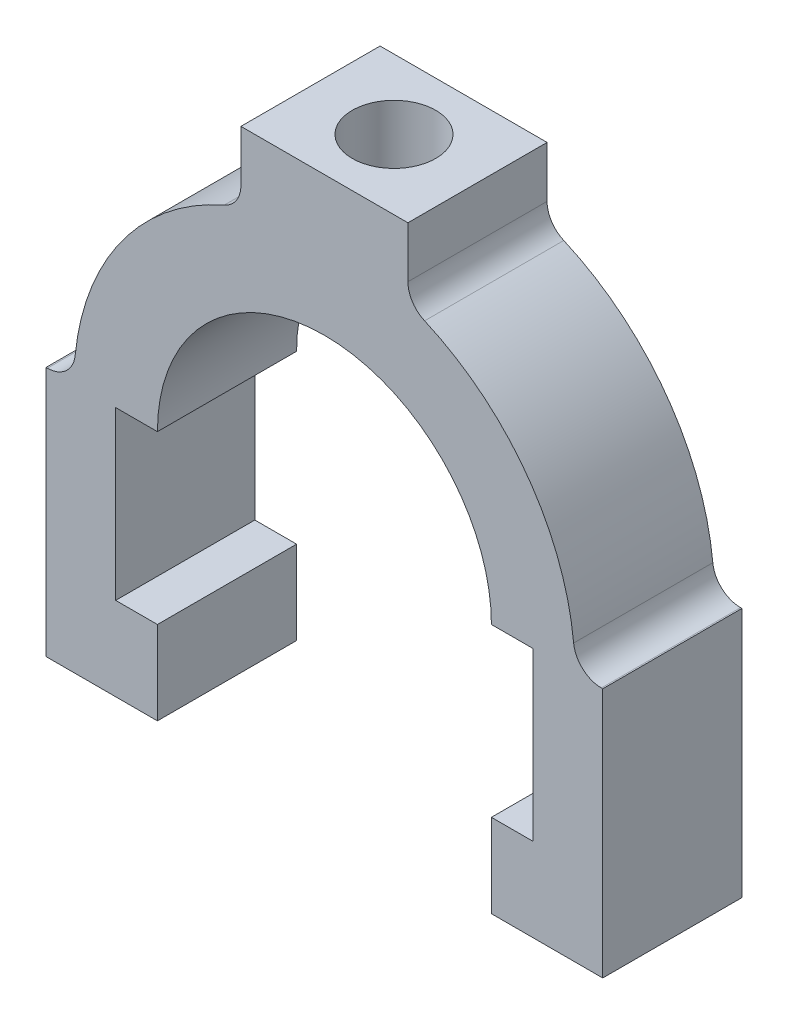
ISO-10303-21;
HEADER;
FILE_DESCRIPTION(('STEP AP214'),'2;1');
FILE_NAME('part.step','',(''),(''),'','','');
FILE_SCHEMA(('AUTOMOTIVE_DESIGN { 1 0 10303 214 1 1 1 1 }'));
ENDSEC;
DATA;
#1=APPLICATION_CONTEXT('core data for automotive mechanical design processes');
#2=APPLICATION_PROTOCOL_DEFINITION('international standard','automotive_design',2000,#1);
#3=PRODUCT_CONTEXT('',#1,'mechanical');
#4=PRODUCT('Part','Part','',(#3));
#5=PRODUCT_RELATED_PRODUCT_CATEGORY('part','',(#4));
#6=PRODUCT_DEFINITION_FORMATION('','',#4);
#7=PRODUCT_DEFINITION_CONTEXT('part definition',#1,'design');
#8=PRODUCT_DEFINITION('design','',#6,#7);
#9=PRODUCT_DEFINITION_SHAPE('','',#8);
#10=(LENGTH_UNIT() NAMED_UNIT(*) SI_UNIT(.MILLI.,.METRE.));
#11=(NAMED_UNIT(*) PLANE_ANGLE_UNIT() SI_UNIT($,.RADIAN.));
#12=(NAMED_UNIT(*) SI_UNIT($,.STERADIAN.) SOLID_ANGLE_UNIT());
#13=UNCERTAINTY_MEASURE_WITH_UNIT(LENGTH_MEASURE(1.E-05),#10,'distance_accuracy_value','');
#14=(GEOMETRIC_REPRESENTATION_CONTEXT(3) GLOBAL_UNCERTAINTY_ASSIGNED_CONTEXT((#13)) GLOBAL_UNIT_ASSIGNED_CONTEXT((#10,
#11,#12)) REPRESENTATION_CONTEXT('',''));
#15=CARTESIAN_POINT('',(0.,0.,0.));
#16=DIRECTION('',(0.,0.,1.));
#17=DIRECTION('',(1.,0.,0.));
#18=AXIS2_PLACEMENT_3D('',#15,#16,#17);
#19=CARTESIAN_POINT('',(-0.20050251573521,40.,20.));
#20=DIRECTION('',(0.,0.,-1.));
#21=DIRECTION('',(-1.,0.,0.));
#22=AXIS2_PLACEMENT_3D('',#19,#20,#21);
#23=CYLINDRICAL_SURFACE('',#22,4.);
#24=CARTESIAN_POINT('',(-0.20050251573521,40.,0.));
#25=DIRECTION('',(0.,0.,-1.));
#26=DIRECTION('',(-1.,0.,0.));
#27=AXIS2_PLACEMENT_3D('',#24,#25,#26);
#28=CIRCLE('',#27,4.);
#29=CARTESIAN_POINT('',(-0.20050251573521,36.,0.));
#30=VERTEX_POINT('',#29);
#31=CARTESIAN_POINT('',(-4.18045226416167,39.6,0.));
#32=VERTEX_POINT('',#31);
#33=EDGE_CURVE('E239',#30,#32,#28,.T.);
#34=ORIENTED_EDGE('',*,*,#33,.T.);
#35=DIRECTION('',(0.,0.,-1.));
#36=VECTOR('',#35,1.);
#37=CARTESIAN_POINT('',(-4.18045226416167,39.6,20.));
#38=LINE('',#37,#36);
#39=CARTESIAN_POINT('',(-4.18045226416167,39.6,20.));
#40=VERTEX_POINT('',#39);
#41=EDGE_CURVE('E11',#40,#32,#38,.T.);
#42=ORIENTED_EDGE('',*,*,#41,.F.);
#43=CARTESIAN_POINT('',(-0.20050251573521,40.,20.));
#44=DIRECTION('',(0.,0.,-1.));
#45=DIRECTION('',(-1.,0.,0.));
#46=AXIS2_PLACEMENT_3D('',#43,#44,#45);
#47=CIRCLE('',#46,4.);
#48=CARTESIAN_POINT('',(-0.20050251573521,36.,20.));
#49=VERTEX_POINT('',#48);
#50=EDGE_CURVE('E299',#49,#40,#47,.T.);
#51=ORIENTED_EDGE('',*,*,#50,.F.);
#52=DIRECTION('',(0.,0.,-1.));
#53=VECTOR('',#52,1.);
#54=CARTESIAN_POINT('',(-0.20050251573521,36.,20.));
#55=LINE('',#54,#53);
#56=EDGE_CURVE('E238',#49,#30,#55,.T.);
#57=ORIENTED_EDGE('',*,*,#56,.T.);
#58=EDGE_LOOP('',(#34,#42,#51,#57));
#59=FACE_BOUND('',#58,.T.);
#60=ADVANCED_FACE('F39',(#59),#23,.F.);
#61=CARTESIAN_POINT('',(-40.,36.,20.));
#62=DIRECTION('',(0.,0.,-1.));
#63=DIRECTION('',(-1.,0.,0.));
#64=AXIS2_PLACEMENT_3D('',#61,#62,#63);
#65=CYLINDRICAL_SURFACE('',#64,36.);
#66=CARTESIAN_POINT('',(-40.,36.,0.));
#67=DIRECTION('',(0.,0.,1.));
#68=DIRECTION('',(1.,0.,0.));
#69=AXIS2_PLACEMENT_3D('',#66,#67,#68);
#70=CIRCLE('',#69,36.);
#71=CARTESIAN_POINT('',(-25.6,68.9945450036821,0.));
#72=VERTEX_POINT('',#71);
#73=EDGE_CURVE('E242',#32,#72,#70,.T.);
#74=ORIENTED_EDGE('',*,*,#73,.T.);
#75=DIRECTION('',(0.,0.,-1.));
#76=VECTOR('',#75,1.);
#77=CARTESIAN_POINT('',(-25.6,68.9945450036821,20.));
#78=LINE('',#77,#76);
#79=CARTESIAN_POINT('',(-25.6,68.9945450036821,20.));
#80=VERTEX_POINT('',#79);
#81=EDGE_CURVE('E53',#80,#72,#78,.T.);
#82=ORIENTED_EDGE('',*,*,#81,.F.);
#83=CARTESIAN_POINT('',(-40.,36.,20.));
#84=DIRECTION('',(0.,0.,1.));
#85=DIRECTION('',(1.,0.,0.));
#86=AXIS2_PLACEMENT_3D('',#83,#84,#85);
#87=CIRCLE('',#86,36.);
#88=EDGE_CURVE('E151',#40,#80,#87,.T.);
#89=ORIENTED_EDGE('',*,*,#88,.F.);
#90=ORIENTED_EDGE('',*,*,#41,.T.);
#91=EDGE_LOOP('',(#74,#82,#89,#90));
#92=FACE_BOUND('',#91,.T.);
#93=ADVANCED_FACE('F428',(#92),#65,.T.);
#94=CARTESIAN_POINT('',(-24.,72.6606055596468,20.));
#95=DIRECTION('',(0.,0.,-1.));
#96=DIRECTION('',(-1.,0.,0.));
#97=AXIS2_PLACEMENT_3D('',#94,#95,#96);
#98=CYLINDRICAL_SURFACE('',#97,4.00000000000002);
#99=CARTESIAN_POINT('',(-24.,72.6606055596468,0.));
#100=DIRECTION('',(0.,0.,-1.));
#101=DIRECTION('',(-1.,0.,0.));
#102=AXIS2_PLACEMENT_3D('',#99,#100,#101);
#103=CIRCLE('',#102,4.00000000000002);
#104=CARTESIAN_POINT('',(-28.,72.6606055596468,0.));
#105=VERTEX_POINT('',#104);
#106=EDGE_CURVE('E244',#72,#105,#103,.T.);
#107=ORIENTED_EDGE('',*,*,#106,.T.);
#108=DIRECTION('',(0.,0.,-1.));
#109=VECTOR('',#108,1.);
#110=CARTESIAN_POINT('',(-28.,72.6606055596468,20.));
#111=LINE('',#110,#109);
#112=CARTESIAN_POINT('',(-28.,72.6606055596468,20.));
#113=VERTEX_POINT('',#112);
#114=EDGE_CURVE('E341',#113,#105,#111,.T.);
#115=ORIENTED_EDGE('',*,*,#114,.F.);
#116=CARTESIAN_POINT('',(-24.,72.6606055596468,20.));
#117=DIRECTION('',(0.,0.,-1.));
#118=DIRECTION('',(-1.,0.,0.));
#119=AXIS2_PLACEMENT_3D('',#116,#117,#118);
#120=CIRCLE('',#119,4.00000000000002);
#121=EDGE_CURVE('E350',#80,#113,#120,.T.);
#122=ORIENTED_EDGE('',*,*,#121,.F.);
#123=ORIENTED_EDGE('',*,*,#81,.T.);
#124=EDGE_LOOP('',(#107,#115,#122,#123));
#125=FACE_BOUND('',#124,.T.);
#126=ADVANCED_FACE('F348',(#125),#98,.F.);
#127=CARTESIAN_POINT('',(-28.,72.6606055596466,20.));
#128=DIRECTION('',(-1.,0.,0.));
#129=DIRECTION('',(0.,-1.,0.));
#130=AXIS2_PLACEMENT_3D('',#127,#128,#129);
#131=PLANE('',#130);
#132=DIRECTION('',(0.,1.,0.));
#133=VECTOR('',#132,1.);
#134=CARTESIAN_POINT('',(-28.,72.6606055596466,0.));
#135=LINE('',#134,#133);
#136=CARTESIAN_POINT('',(-28.0000000000002,80.,0.));
#137=VERTEX_POINT('',#136);
#138=EDGE_CURVE('E246',#105,#137,#135,.T.);
#139=ORIENTED_EDGE('',*,*,#138,.T.);
#140=DIRECTION('',(0.,0.,-1.));
#141=VECTOR('',#140,1.);
#142=CARTESIAN_POINT('',(-28.0000000000002,80.,20.));
#143=LINE('',#142,#141);
#144=CARTESIAN_POINT('',(-28.0000000000002,80.,20.));
#145=VERTEX_POINT('',#144);
#146=EDGE_CURVE('E339',#145,#137,#143,.T.);
#147=ORIENTED_EDGE('',*,*,#146,.F.);
#148=DIRECTION('',(0.,1.,0.));
#149=VECTOR('',#148,1.);
#150=CARTESIAN_POINT('',(-28.,72.6606055596466,20.));
#151=LINE('',#150,#149);
#152=EDGE_CURVE('E361',#113,#145,#151,.T.);
#153=ORIENTED_EDGE('',*,*,#152,.F.);
#154=ORIENTED_EDGE('',*,*,#114,.T.);
#155=EDGE_LOOP('',(#139,#147,#153,#154));
#156=FACE_BOUND('',#155,.T.);
#157=ADVANCED_FACE('F358',(#156),#131,.F.);
#158=CARTESIAN_POINT('',(-52.,80.,20.));
#159=DIRECTION('',(0.,1.,0.));
#160=DIRECTION('',(0.,0.,1.));
#161=AXIS2_PLACEMENT_3D('',#158,#159,#160);
#162=PLANE('',#161);
#163=CARTESIAN_POINT('',(-40.,80.,10.));
#164=DIRECTION('',(0.,1.,0.));
#165=DIRECTION('',(0.,0.,1.));
#166=AXIS2_PLACEMENT_3D('',#163,#164,#165);
#167=CIRCLE('',#166,6.);
#168=CARTESIAN_POINT('',(-40.,80.,16.));
#169=VERTEX_POINT('',#168);
#170=EDGE_CURVE('E564',#169,#169,#167,.T.);
#171=ORIENTED_EDGE('',*,*,#170,.F.);
#172=EDGE_LOOP('',(#171));
#173=FACE_BOUND('',#172,.T.);
#174=DIRECTION('',(1.,0.,0.));
#175=VECTOR('',#174,1.);
#176=CARTESIAN_POINT('',(-52.,80.,0.));
#177=LINE('',#176,#175);
#178=CARTESIAN_POINT('',(-52.,80.,0.));
#179=VERTEX_POINT('',#178);
#180=EDGE_CURVE('E249',#179,#137,#177,.T.);
#181=ORIENTED_EDGE('',*,*,#180,.F.);
#182=DIRECTION('',(0.,0.,-1.));
#183=VECTOR('',#182,1.);
#184=CARTESIAN_POINT('',(-52.,80.,20.));
#185=LINE('',#184,#183);
#186=CARTESIAN_POINT('',(-52.,80.,20.));
#187=VERTEX_POINT('',#186);
#188=EDGE_CURVE('E337',#187,#179,#185,.T.);
#189=ORIENTED_EDGE('',*,*,#188,.F.);
#190=DIRECTION('',(1.,0.,0.));
#191=VECTOR('',#190,1.);
#192=CARTESIAN_POINT('',(-52.,80.,20.));
#193=LINE('',#192,#191);
#194=EDGE_CURVE('E363',#187,#145,#193,.T.);
#195=ORIENTED_EDGE('',*,*,#194,.T.);
#196=ORIENTED_EDGE('',*,*,#146,.T.);
#197=EDGE_LOOP('',(#181,#189,#195,#196));
#198=FACE_BOUND('',#197,.T.);
#199=ADVANCED_FACE('F439',(#173,#198),#162,.T.);
#200=CARTESIAN_POINT('',(-52.0000000000001,72.6606055596466,20.));
#201=DIRECTION('',(-1.,0.,0.));
#202=DIRECTION('',(0.,-1.,0.));
#203=AXIS2_PLACEMENT_3D('',#200,#201,#202);
#204=PLANE('',#203);
#205=DIRECTION('',(0.,1.,0.));
#206=VECTOR('',#205,1.);
#207=CARTESIAN_POINT('',(-52.0000000000001,72.6606055596466,0.));
#208=LINE('',#207,#206);
#209=CARTESIAN_POINT('',(-52.0000000000001,72.6606055596466,0.));
#210=VERTEX_POINT('',#209);
#211=EDGE_CURVE('E252',#210,#179,#208,.T.);
#212=ORIENTED_EDGE('',*,*,#211,.F.);
#213=DIRECTION('',(0.,0.,-1.));
#214=VECTOR('',#213,1.);
#215=CARTESIAN_POINT('',(-52.0000000000001,72.6606055596466,20.));
#216=LINE('',#215,#214);
#217=CARTESIAN_POINT('',(-52.0000000000001,72.6606055596466,20.));
#218=VERTEX_POINT('',#217);
#219=EDGE_CURVE('E335',#218,#210,#216,.T.);
#220=ORIENTED_EDGE('',*,*,#219,.F.);
#221=DIRECTION('',(0.,1.,0.));
#222=VECTOR('',#221,1.);
#223=CARTESIAN_POINT('',(-52.0000000000001,72.6606055596466,20.));
#224=LINE('',#223,#222);
#225=EDGE_CURVE('E365',#218,#187,#224,.T.);
#226=ORIENTED_EDGE('',*,*,#225,.T.);
#227=ORIENTED_EDGE('',*,*,#188,.T.);
#228=EDGE_LOOP('',(#212,#220,#226,#227));
#229=FACE_BOUND('',#228,.T.);
#230=ADVANCED_FACE('F442',(#229),#204,.T.);
#231=CARTESIAN_POINT('',(-56.,72.6606055596467,20.));
#232=DIRECTION('',(0.,0.,-1.));
#233=DIRECTION('',(-1.,0.,0.));
#234=AXIS2_PLACEMENT_3D('',#231,#232,#233);
#235=CYLINDRICAL_SURFACE('',#234,3.99999999999996);
#236=CARTESIAN_POINT('',(-56.,72.6606055596467,0.));
#237=DIRECTION('',(0.,0.,1.));
#238=DIRECTION('',(1.,0.,0.));
#239=AXIS2_PLACEMENT_3D('',#236,#237,#238);
#240=CIRCLE('',#239,3.99999999999996);
#241=CARTESIAN_POINT('',(-54.4,68.994545003682,0.));
#242=VERTEX_POINT('',#241);
#243=EDGE_CURVE('E255',#242,#210,#240,.T.);
#244=ORIENTED_EDGE('',*,*,#243,.F.);
#245=DIRECTION('',(0.,0.,-1.));
#246=VECTOR('',#245,1.);
#247=CARTESIAN_POINT('',(-54.4,68.994545003682,20.));
#248=LINE('',#247,#246);
#249=CARTESIAN_POINT('',(-54.4,68.994545003682,20.));
#250=VERTEX_POINT('',#249);
#251=EDGE_CURVE('E333',#250,#242,#248,.T.);
#252=ORIENTED_EDGE('',*,*,#251,.F.);
#253=CARTESIAN_POINT('',(-56.,72.6606055596467,20.));
#254=DIRECTION('',(0.,0.,1.));
#255=DIRECTION('',(1.,0.,0.));
#256=AXIS2_PLACEMENT_3D('',#253,#254,#255);
#257=CIRCLE('',#256,3.99999999999996);
#258=EDGE_CURVE('E372',#250,#218,#257,.T.);
#259=ORIENTED_EDGE('',*,*,#258,.T.);
#260=ORIENTED_EDGE('',*,*,#219,.T.);
#261=EDGE_LOOP('',(#244,#252,#259,#260));
#262=FACE_BOUND('',#261,.T.);
#263=ADVANCED_FACE('F446',(#262),#235,.F.);
#264=CARTESIAN_POINT('',(-40.,36.,20.));
#265=DIRECTION('',(0.,0.,-1.));
#266=DIRECTION('',(-1.,0.,0.));
#267=AXIS2_PLACEMENT_3D('',#264,#265,#266);
#268=CYLINDRICAL_SURFACE('',#267,36.);
#269=CARTESIAN_POINT('',(-40.,36.,0.));
#270=DIRECTION('',(0.,0.,1.));
#271=DIRECTION('',(1.,0.,0.));
#272=AXIS2_PLACEMENT_3D('',#269,#270,#271);
#273=CIRCLE('',#272,36.);
#274=CARTESIAN_POINT('',(-75.8195477358383,39.6,0.));
#275=VERTEX_POINT('',#274);
#276=EDGE_CURVE('E258',#242,#275,#273,.T.);
#277=ORIENTED_EDGE('',*,*,#276,.T.);
#278=DIRECTION('',(0.,0.,-1.));
#279=VECTOR('',#278,1.);
#280=CARTESIAN_POINT('',(-75.8195477358383,39.6,20.));
#281=LINE('',#280,#279);
#282=CARTESIAN_POINT('',(-75.8195477358383,39.6,20.));
#283=VERTEX_POINT('',#282);
#284=EDGE_CURVE('E331',#283,#275,#281,.T.);
#285=ORIENTED_EDGE('',*,*,#284,.F.);
#286=CARTESIAN_POINT('',(-40.,36.,20.));
#287=DIRECTION('',(0.,0.,1.));
#288=DIRECTION('',(1.,0.,0.));
#289=AXIS2_PLACEMENT_3D('',#286,#287,#288);
#290=CIRCLE('',#289,36.);
#291=EDGE_CURVE('E375',#250,#283,#290,.T.);
#292=ORIENTED_EDGE('',*,*,#291,.F.);
#293=ORIENTED_EDGE('',*,*,#251,.T.);
#294=EDGE_LOOP('',(#277,#285,#292,#293));
#295=FACE_BOUND('',#294,.T.);
#296=ADVANCED_FACE('F450',(#295),#268,.T.);
#297=CARTESIAN_POINT('',(-79.7994974842648,40.,20.));
#298=DIRECTION('',(0.,0.,-1.));
#299=DIRECTION('',(-1.,0.,0.));
#300=AXIS2_PLACEMENT_3D('',#297,#298,#299);
#301=CYLINDRICAL_SURFACE('',#300,3.99999999999999);
#302=CARTESIAN_POINT('',(-79.7994974842648,40.,0.));
#303=DIRECTION('',(0.,0.,1.));
#304=DIRECTION('',(1.,0.,0.));
#305=AXIS2_PLACEMENT_3D('',#302,#303,#304);
#306=CIRCLE('',#305,3.99999999999999);
#307=CARTESIAN_POINT('',(-79.7994974842648,36.,0.));
#308=VERTEX_POINT('',#307);
#309=EDGE_CURVE('E261',#308,#275,#306,.T.);
#310=ORIENTED_EDGE('',*,*,#309,.F.);
#311=DIRECTION('',(0.,0.,-1.));
#312=VECTOR('',#311,1.);
#313=CARTESIAN_POINT('',(-79.7994974842648,36.,20.));
#314=LINE('',#313,#312);
#315=CARTESIAN_POINT('',(-79.7994974842648,36.,20.));
#316=VERTEX_POINT('',#315);
#317=EDGE_CURVE('E329',#316,#308,#314,.T.);
#318=ORIENTED_EDGE('',*,*,#317,.F.);
#319=CARTESIAN_POINT('',(-79.7994974842648,40.,20.));
#320=DIRECTION('',(0.,0.,1.));
#321=DIRECTION('',(1.,0.,0.));
#322=AXIS2_PLACEMENT_3D('',#319,#320,#321);
#323=CIRCLE('',#322,3.99999999999999);
#324=EDGE_CURVE('E377',#316,#283,#323,.T.);
#325=ORIENTED_EDGE('',*,*,#324,.T.);
#326=ORIENTED_EDGE('',*,*,#284,.T.);
#327=EDGE_LOOP('',(#310,#318,#325,#326));
#328=FACE_BOUND('',#327,.T.);
#329=ADVANCED_FACE('F454',(#328),#301,.F.);
#330=CARTESIAN_POINT('',(-80.,36.,20.));
#331=DIRECTION('',(0.,1.,0.));
#332=DIRECTION('',(0.,0.,1.));
#333=AXIS2_PLACEMENT_3D('',#330,#331,#332);
#334=PLANE('',#333);
#335=DIRECTION('',(1.,0.,0.));
#336=VECTOR('',#335,1.);
#337=CARTESIAN_POINT('',(-80.,36.,0.));
#338=LINE('',#337,#336);
#339=CARTESIAN_POINT('',(-80.,36.,0.));
#340=VERTEX_POINT('',#339);
#341=EDGE_CURVE('E264',#340,#308,#338,.T.);
#342=ORIENTED_EDGE('',*,*,#341,.F.);
#343=DIRECTION('',(0.,0.,-1.));
#344=VECTOR('',#343,1.);
#345=CARTESIAN_POINT('',(-80.,36.,20.));
#346=LINE('',#345,#344);
#347=CARTESIAN_POINT('',(-80.,36.,20.));
#348=VERTEX_POINT('',#347);
#349=EDGE_CURVE('E327',#348,#340,#346,.T.);
#350=ORIENTED_EDGE('',*,*,#349,.F.);
#351=DIRECTION('',(1.,0.,0.));
#352=VECTOR('',#351,1.);
#353=CARTESIAN_POINT('',(-80.,36.,20.));
#354=LINE('',#353,#352);
#355=EDGE_CURVE('E380',#348,#316,#354,.T.);
#356=ORIENTED_EDGE('',*,*,#355,.T.);
#357=ORIENTED_EDGE('',*,*,#317,.T.);
#358=EDGE_LOOP('',(#342,#350,#356,#357));
#359=FACE_BOUND('',#358,.T.);
#360=ADVANCED_FACE('F458',(#359),#334,.T.);
#361=CARTESIAN_POINT('',(-80.,0.,20.));
#362=DIRECTION('',(-1.,0.,0.));
#363=DIRECTION('',(0.,0.,1.));
#364=AXIS2_PLACEMENT_3D('',#361,#362,#363);
#365=PLANE('',#364);
#366=DIRECTION('',(0.,1.,0.));
#367=VECTOR('',#366,1.);
#368=CARTESIAN_POINT('',(-80.,0.,0.));
#369=LINE('',#368,#367);
#370=CARTESIAN_POINT('',(-80.,0.,0.));
#371=VERTEX_POINT('',#370);
#372=EDGE_CURVE('E267',#371,#340,#369,.T.);
#373=ORIENTED_EDGE('',*,*,#372,.F.);
#374=DIRECTION('',(0.,0.,-1.));
#375=VECTOR('',#374,1.);
#376=CARTESIAN_POINT('',(-80.,0.,20.));
#377=LINE('',#376,#375);
#378=CARTESIAN_POINT('',(-80.,0.,20.));
#379=VERTEX_POINT('',#378);
#380=EDGE_CURVE('E325',#379,#371,#377,.T.);
#381=ORIENTED_EDGE('',*,*,#380,.F.);
#382=DIRECTION('',(0.,1.,0.));
#383=VECTOR('',#382,1.);
#384=CARTESIAN_POINT('',(-80.,0.,20.));
#385=LINE('',#384,#383);
#386=EDGE_CURVE('E383',#379,#348,#385,.T.);
#387=ORIENTED_EDGE('',*,*,#386,.T.);
#388=ORIENTED_EDGE('',*,*,#349,.T.);
#389=EDGE_LOOP('',(#373,#381,#387,#388));
#390=FACE_BOUND('',#389,.T.);
#391=ADVANCED_FACE('F462',(#390),#365,.T.);
#392=CARTESIAN_POINT('',(-80.,0.,20.));
#393=DIRECTION('',(0.,1.,0.));
#394=DIRECTION('',(0.,0.,1.));
#395=AXIS2_PLACEMENT_3D('',#392,#393,#394);
#396=PLANE('',#395);
#397=DIRECTION('',(1.,0.,0.));
#398=VECTOR('',#397,1.);
#399=CARTESIAN_POINT('',(-80.,0.,0.));
#400=LINE('',#399,#398);
#401=CARTESIAN_POINT('',(-64.,0.,0.));
#402=VERTEX_POINT('',#401);
#403=EDGE_CURVE('E270',#371,#402,#400,.T.);
#404=ORIENTED_EDGE('',*,*,#403,.T.);
#405=DIRECTION('',(0.,0.,-1.));
#406=VECTOR('',#405,1.);
#407=CARTESIAN_POINT('',(-64.,0.,20.));
#408=LINE('',#407,#406);
#409=CARTESIAN_POINT('',(-64.,0.,20.));
#410=VERTEX_POINT('',#409);
#411=EDGE_CURVE('E322',#410,#402,#408,.T.);
#412=ORIENTED_EDGE('',*,*,#411,.F.);
#413=DIRECTION('',(1.,0.,0.));
#414=VECTOR('',#413,1.);
#415=CARTESIAN_POINT('',(-80.,0.,20.));
#416=LINE('',#415,#414);
#417=EDGE_CURVE('E386',#379,#410,#416,.T.);
#418=ORIENTED_EDGE('',*,*,#417,.F.);
#419=ORIENTED_EDGE('',*,*,#380,.T.);
#420=EDGE_LOOP('',(#404,#412,#418,#419));
#421=FACE_BOUND('',#420,.T.);
#422=ADVANCED_FACE('F466',(#421),#396,.F.);
#423=CARTESIAN_POINT('',(-64.,0.,20.));
#424=DIRECTION('',(-1.,0.,0.));
#425=DIRECTION('',(0.,0.,1.));
#426=AXIS2_PLACEMENT_3D('',#423,#424,#425);
#427=PLANE('',#426);
#428=DIRECTION('',(0.,1.,0.));
#429=VECTOR('',#428,1.);
#430=CARTESIAN_POINT('',(-64.,0.,0.));
#431=LINE('',#430,#429);
#432=CARTESIAN_POINT('',(-64.,12.,0.));
#433=VERTEX_POINT('',#432);
#434=EDGE_CURVE('E272',#402,#433,#431,.T.);
#435=ORIENTED_EDGE('',*,*,#434,.T.);
#436=DIRECTION('',(0.,0.,-1.));
#437=VECTOR('',#436,1.);
#438=CARTESIAN_POINT('',(-64.,12.,20.));
#439=LINE('',#438,#437);
#440=CARTESIAN_POINT('',(-64.,12.,20.));
#441=VERTEX_POINT('',#440);
#442=EDGE_CURVE('E319',#441,#433,#439,.T.);
#443=ORIENTED_EDGE('',*,*,#442,.F.);
#444=DIRECTION('',(0.,1.,0.));
#445=VECTOR('',#444,1.);
#446=CARTESIAN_POINT('',(-64.,0.,20.));
#447=LINE('',#446,#445);
#448=EDGE_CURVE('E388',#410,#441,#447,.T.);
#449=ORIENTED_EDGE('',*,*,#448,.F.);
#450=ORIENTED_EDGE('',*,*,#411,.T.);
#451=EDGE_LOOP('',(#435,#443,#449,#450));
#452=FACE_BOUND('',#451,.T.);
#453=ADVANCED_FACE('F470',(#452),#427,.F.);
#454=CARTESIAN_POINT('',(-64.,12.,20.));
#455=DIRECTION('',(0.,-1.,0.));
#456=DIRECTION('',(0.,0.,-1.));
#457=AXIS2_PLACEMENT_3D('',#454,#455,#456);
#458=PLANE('',#457);
#459=DIRECTION('',(-1.,0.,0.));
#460=VECTOR('',#459,1.);
#461=CARTESIAN_POINT('',(-64.,12.,0.));
#462=LINE('',#461,#460);
#463=CARTESIAN_POINT('',(-70.,12.,0.));
#464=VERTEX_POINT('',#463);
#465=EDGE_CURVE('E274',#433,#464,#462,.T.);
#466=ORIENTED_EDGE('',*,*,#465,.T.);
#467=DIRECTION('',(0.,0.,-1.));
#468=VECTOR('',#467,1.);
#469=CARTESIAN_POINT('',(-70.,12.,20.));
#470=LINE('',#469,#468);
#471=CARTESIAN_POINT('',(-70.,12.,20.));
#472=VERTEX_POINT('',#471);
#473=EDGE_CURVE('E316',#472,#464,#470,.T.);
#474=ORIENTED_EDGE('',*,*,#473,.F.);
#475=DIRECTION('',(-1.,0.,0.));
#476=VECTOR('',#475,1.);
#477=CARTESIAN_POINT('',(-64.,12.,20.));
#478=LINE('',#477,#476);
#479=EDGE_CURVE('E390',#441,#472,#478,.T.);
#480=ORIENTED_EDGE('',*,*,#479,.F.);
#481=ORIENTED_EDGE('',*,*,#442,.T.);
#482=EDGE_LOOP('',(#466,#474,#480,#481));
#483=FACE_BOUND('',#482,.T.);
#484=ADVANCED_FACE('F474',(#483),#458,.F.);
#485=CARTESIAN_POINT('',(-70.,12.,20.));
#486=DIRECTION('',(-1.,0.,0.));
#487=DIRECTION('',(0.,0.,1.));
#488=AXIS2_PLACEMENT_3D('',#485,#486,#487);
#489=PLANE('',#488);
#490=DIRECTION('',(0.,1.,0.));
#491=VECTOR('',#490,1.);
#492=CARTESIAN_POINT('',(-70.,12.,0.));
#493=LINE('',#492,#491);
#494=CARTESIAN_POINT('',(-70.,36.,0.));
#495=VERTEX_POINT('',#494);
#496=EDGE_CURVE('E276',#464,#495,#493,.T.);
#497=ORIENTED_EDGE('',*,*,#496,.T.);
#498=DIRECTION('',(0.,0.,-1.));
#499=VECTOR('',#498,1.);
#500=CARTESIAN_POINT('',(-70.,36.,20.));
#501=LINE('',#500,#499);
#502=CARTESIAN_POINT('',(-70.,36.,20.));
#503=VERTEX_POINT('',#502);
#504=EDGE_CURVE('E313',#503,#495,#501,.T.);
#505=ORIENTED_EDGE('',*,*,#504,.F.);
#506=DIRECTION('',(0.,1.,0.));
#507=VECTOR('',#506,1.);
#508=CARTESIAN_POINT('',(-70.,12.,20.));
#509=LINE('',#508,#507);
#510=EDGE_CURVE('E392',#472,#503,#509,.T.);
#511=ORIENTED_EDGE('',*,*,#510,.F.);
#512=ORIENTED_EDGE('',*,*,#473,.T.);
#513=EDGE_LOOP('',(#497,#505,#511,#512));
#514=FACE_BOUND('',#513,.T.);
#515=ADVANCED_FACE('F478',(#514),#489,.F.);
#516=CARTESIAN_POINT('',(-70.,36.,20.));
#517=DIRECTION('',(0.,1.,0.));
#518=DIRECTION('',(-1.,0.,0.));
#519=AXIS2_PLACEMENT_3D('',#516,#517,#518);
#520=PLANE('',#519);
#521=DIRECTION('',(1.,0.,0.));
#522=VECTOR('',#521,1.);
#523=CARTESIAN_POINT('',(-70.,36.,0.));
#524=LINE('',#523,#522);
#525=CARTESIAN_POINT('',(-64.,36.,0.));
#526=VERTEX_POINT('',#525);
#527=EDGE_CURVE('E278',#495,#526,#524,.T.);
#528=ORIENTED_EDGE('',*,*,#527,.T.);
#529=DIRECTION('',(0.,0.,-1.));
#530=VECTOR('',#529,1.);
#531=CARTESIAN_POINT('',(-64.,36.,20.));
#532=LINE('',#531,#530);
#533=CARTESIAN_POINT('',(-64.,36.,20.));
#534=VERTEX_POINT('',#533);
#535=EDGE_CURVE('E311',#534,#526,#532,.T.);
#536=ORIENTED_EDGE('',*,*,#535,.F.);
#537=DIRECTION('',(1.,0.,0.));
#538=VECTOR('',#537,1.);
#539=CARTESIAN_POINT('',(-70.,36.,20.));
#540=LINE('',#539,#538);
#541=EDGE_CURVE('E394',#503,#534,#540,.T.);
#542=ORIENTED_EDGE('',*,*,#541,.F.);
#543=ORIENTED_EDGE('',*,*,#504,.T.);
#544=EDGE_LOOP('',(#528,#536,#542,#543));
#545=FACE_BOUND('',#544,.T.);
#546=ADVANCED_FACE('F482',(#545),#520,.F.);
#547=CARTESIAN_POINT('',(-40.,36.,20.));
#548=DIRECTION('',(0.,0.,-1.));
#549=DIRECTION('',(-1.,0.,0.));
#550=AXIS2_PLACEMENT_3D('',#547,#548,#549);
#551=CYLINDRICAL_SURFACE('',#550,24.);
#552=CARTESIAN_POINT('',(-40.,60.,16.));
#553=CARTESIAN_POINT('',(-40.1658053874038,60.0000029962766,16.0000049489736));
#554=CARTESIAN_POINT('',(-40.3315566180958,59.9982792337243,15.9931261251076));
#555=CARTESIAN_POINT('',(-40.6618983414998,59.9914389070726,15.9656801379836));
#556=CARTESIAN_POINT('',(-40.8264886996123,59.9863219558732,15.9451114129599));
#557=CARTESIAN_POINT('',(-41.1533146828943,59.9728312747807,15.8904442806045));
#558=CARTESIAN_POINT('',(-41.3155495613604,59.964456534561,15.8563416759916));
#559=CARTESIAN_POINT('',(-41.6365299935339,59.9446785682942,15.7748760721035));
#560=CARTESIAN_POINT('',(-41.7952742379173,59.9332742261501,15.7275081855849));
#561=CARTESIAN_POINT('',(-42.1078589082714,59.9077704080524,15.6199828017296));
#562=CARTESIAN_POINT('',(-42.2617067496351,59.8936752583917,15.5598458174177));
#563=CARTESIAN_POINT('',(-42.5637862382126,59.8631527081915,15.4271745897842));
#564=CARTESIAN_POINT('',(-42.7120157871281,59.8467244469549,15.3546357693375));
#565=CARTESIAN_POINT('',(-43.0017766103355,59.8119848981805,15.1977372548709));
#566=CARTESIAN_POINT('',(-43.1433102969363,59.7936742964516,15.1133818620482));
#567=CARTESIAN_POINT('',(-43.4188852665449,59.7556431475739,14.9333882354096));
#568=CARTESIAN_POINT('',(-43.5529237053449,59.735922071578,14.8377457607558));
#569=CARTESIAN_POINT('',(-43.8149643460239,59.6952304700178,14.6340140827509));
#570=CARTESIAN_POINT('',(-43.9428130891322,59.674243775966,14.5257306874444));
#571=CARTESIAN_POINT('',(-44.1890273684168,59.6319204183454,14.298846966889));
#572=CARTESIAN_POINT('',(-44.3073893684696,59.6105836278175,14.1802428286891));
#573=CARTESIAN_POINT('',(-44.5337748952402,59.568159620478,13.9335611167013));
#574=CARTESIAN_POINT('',(-44.6418010318549,59.5470723418473,13.8054859489905));
#575=CARTESIAN_POINT('',(-44.8468631629984,59.5057198367545,13.5406185834632));
#576=CARTESIAN_POINT('',(-44.9438950855717,59.4854549166434,13.403823185034));
#577=CARTESIAN_POINT('',(-45.1275757933424,59.4460427828086,13.1203993860544));
#578=CARTESIAN_POINT('',(-45.2140532907328,59.4269160793509,12.9736570210366));
#579=CARTESIAN_POINT('',(-45.3743409923908,59.3906650895731,12.6731036888584));
#580=CARTESIAN_POINT('',(-45.4481464054103,59.3735415614194,12.5192900758401));
#581=CARTESIAN_POINT('',(-45.5824381696205,59.3418328254504,12.205771190017));
#582=CARTESIAN_POINT('',(-45.6429311270007,59.3272463593972,12.0460688855721));
#583=CARTESIAN_POINT('',(-45.750162560607,59.301043510543,11.7218770109329));
#584=CARTESIAN_POINT('',(-45.7968961113112,59.2894281915327,11.5573857495113));
#585=CARTESIAN_POINT('',(-45.9141515731667,59.2600431044562,11.0651783074134));
#586=CARTESIAN_POINT('',(-45.9645898609233,59.2470332112981,10.7320163829238));
#587=CARTESIAN_POINT('',(-45.9979584834961,59.2384260885599,10.2298515486397));
#588=CARTESIAN_POINT('',(-46.0020266361395,59.2373766993857,10.0619945228305));
#589=CARTESIAN_POINT('',(-45.9961097080077,59.2389046091482,9.72652435084421));
#590=CARTESIAN_POINT('',(-45.9861244882275,59.2414819439575,9.55891120709583));
#591=CARTESIAN_POINT('',(-45.9359471347459,59.2543754061852,9.06652423822909));
#592=CARTESIAN_POINT('',(-45.8760736384832,59.2697164452628,8.74366776503005));
#593=CARTESIAN_POINT('',(-45.7048964698109,59.3122664593645,8.1129055417415));
#594=CARTESIAN_POINT('',(-45.5935891334897,59.3394762798586,7.80500085847619));
#595=CARTESIAN_POINT('',(-45.3215579872943,59.4030050803747,7.20906160097685));
#596=CARTESIAN_POINT('',(-45.1603466891966,59.4394132393811,6.92125897835463));
#597=CARTESIAN_POINT('',(-44.7934250837914,59.5171882932265,6.37632149481797));
#598=CARTESIAN_POINT('',(-44.5877069897266,59.5585560552156,6.11919201259971));
#599=CARTESIAN_POINT('',(-44.1306537043908,59.6430352608536,5.63518656072917));
#600=CARTESIAN_POINT('',(-43.8781850342093,59.6861627896442,5.40938231393944));
#601=CARTESIAN_POINT('',(-43.3384476684689,59.7682386126258,5.00311475595116));
#602=CARTESIAN_POINT('',(-43.0511779103143,59.8071867791381,4.82265282972542));
#603=CARTESIAN_POINT('',(-42.4484635552449,59.8767092866155,4.51179772857426));
#604=CARTESIAN_POINT('',(-42.1329255733586,59.9072544059235,4.38157865729419));
#605=CARTESIAN_POINT('',(-41.4835040320475,59.9563166788424,4.17633075885331));
#606=CARTESIAN_POINT('',(-41.1496239950252,59.9748361331613,4.10129137454455));
#607=CARTESIAN_POINT('',(-40.4821598830966,59.9974199712544,4.0101697375531));
#608=CARTESIAN_POINT('',(-40.1487868855224,60.0018421411353,3.99262787748009));
#609=CARTESIAN_POINT('',(-39.483868495225,59.9967521917739,4.012996026439));
#610=CARTESIAN_POINT('',(-39.1523229406828,59.987241326857,4.05090104384998));
#611=CARTESIAN_POINT('',(-38.5055429453256,59.9555832478693,4.17988356198871));
#612=CARTESIAN_POINT('',(-38.1901395998405,59.9336253776701,4.27016478740322));
#613=CARTESIAN_POINT('',(-37.5789707544668,59.8795482551267,4.50042860264544));
#614=CARTESIAN_POINT('',(-37.2832072413972,59.8474279766146,4.64041621184185));
#615=CARTESIAN_POINT('',(-36.7139077497653,59.775732355911,4.96894350326124));
#616=CARTESIAN_POINT('',(-36.4408593143635,59.7360348408855,5.15830064078757));
#617=CARTESIAN_POINT('',(-35.9298924635334,59.6537802212633,5.57916344464519));
#618=CARTESIAN_POINT('',(-35.6919801237437,59.6112226239559,5.81067638502544));
#619=CARTESIAN_POINT('',(-35.2520418672476,59.526758837948,6.31599326761707));
#620=CARTESIAN_POINT('',(-35.0510401552254,59.4848942795269,6.59069579218291));
#621=CARTESIAN_POINT('',(-34.6979413389295,59.4077130231476,7.17098555524694));
#622=CARTESIAN_POINT('',(-34.5458420638476,59.3723960345683,7.47657142202354));
#623=CARTESIAN_POINT('',(-34.3583912928713,59.3275859445682,7.95036011901535));
#624=CARTESIAN_POINT('',(-34.3027784186148,59.3140336618751,8.11044327829627));
#625=CARTESIAN_POINT('',(-34.2052423079145,59.2899834650234,8.43493482969514));
#626=CARTESIAN_POINT('',(-34.1633138849427,59.2794843938355,8.59934155755361));
#627=CARTESIAN_POINT('',(-34.0935100254638,59.2618715740422,8.93128294865933));
#628=CARTESIAN_POINT('',(-34.065634826614,59.2547578826878,9.09881766475502));
#629=CARTESIAN_POINT('',(-34.0241791493696,59.2441396190328,9.43575786636507));
#630=CARTESIAN_POINT('',(-34.0105979999193,59.2406348773048,9.60516326368014));
#631=CARTESIAN_POINT('',(-33.9980365271465,59.2373938489065,9.93966894494398));
#632=CARTESIAN_POINT('',(-33.9986477945879,59.2375521518778,10.1047530313471));
#633=CARTESIAN_POINT('',(-34.0134642369363,59.2413736324535,10.4342665001569));
#634=CARTESIAN_POINT('',(-34.0276691024869,59.2450367302975,10.598695897377));
#635=CARTESIAN_POINT('',(-34.069554244903,59.2557579721328,10.9257410344122));
#636=CARTESIAN_POINT('',(-34.0972365870963,59.2628166364686,11.0883564923458));
#637=CARTESIAN_POINT('',(-34.1658333209155,59.2801148571724,11.4105376668584));
#638=CARTESIAN_POINT('',(-34.2067430491368,59.2903532924405,11.5701044373057));
#639=CARTESIAN_POINT('',(-34.3011979628329,59.313644179093,11.8842523863261));
#640=CARTESIAN_POINT('',(-34.3546705635675,59.3266804293978,12.0388566126103));
#641=CARTESIAN_POINT('',(-34.4739414711643,59.3552228194459,12.3429342235871));
#642=CARTESIAN_POINT('',(-34.5397355019797,59.3707281020539,12.4924093670543));
#643=CARTESIAN_POINT('',(-34.6832116445797,59.4037855982137,12.7853867449869));
#644=CARTESIAN_POINT('',(-34.7608991008746,59.4213387311534,12.9288862571421));
#645=CARTESIAN_POINT('',(-34.9275692602936,59.4579990976357,13.208891456609));
#646=CARTESIAN_POINT('',(-35.0165482595079,59.4771058208267,13.3453994168081));
#647=CARTESIAN_POINT('',(-35.2077270967162,59.5168854335111,13.6141426790837));
#648=CARTESIAN_POINT('',(-35.3102144387853,59.5375863850894,13.7461693832206));
#649=CARTESIAN_POINT('',(-35.5257565481536,59.579507882839,14.001125128433));
#650=CARTESIAN_POINT('',(-35.6388077132828,59.6007282500856,14.1240572452482));
#651=CARTESIAN_POINT('',(-35.8748358045306,59.6431258862839,14.3601488853344));
#652=CARTESIAN_POINT('',(-35.9978185542701,59.6643031223737,14.4733025931207));
#653=CARTESIAN_POINT('',(-36.2528082349859,59.7060168559165,14.6889686779036));
#654=CARTESIAN_POINT('',(-36.3848118657953,59.7265535837286,14.7914849122748));
#655=CARTESIAN_POINT('',(-36.6595581329393,59.7668061369628,14.9870231939444));
#656=CARTESIAN_POINT('',(-36.802454461395,59.7864996932668,15.0798340610588));
#657=CARTESIAN_POINT('',(-37.0957434714297,59.824087485808,15.253026701334));
#658=CARTESIAN_POINT('',(-37.2461333697718,59.8419823827553,15.3334130443325));
#659=CARTESIAN_POINT('',(-37.5533630711459,59.8754647710401,15.4811494871589));
#660=CARTESIAN_POINT('',(-37.7102000584483,59.8910532562916,15.5485052062122));
#661=CARTESIAN_POINT('',(-38.0292099816936,59.9194829588902,15.6696663554929));
#662=CARTESIAN_POINT('',(-38.191382108516,59.9323245906257,15.723473829816));
#663=CARTESIAN_POINT('',(-38.6222236952707,59.9619049568243,15.8462328539043));
#664=CARTESIAN_POINT('',(-38.8944085273423,59.9761014751911,15.9037953778408));
#665=CARTESIAN_POINT('',(-39.4444464975555,59.9951461360495,15.9806733681391));
#666=CARTESIAN_POINT('',(-39.7222992077805,59.9999949816564,15.9999917111627));
#667=CARTESIAN_POINT('',(-40.,60.,16.));
#668=B_SPLINE_CURVE_WITH_KNOTS('',3,(#552,#553,#554,#555,#556,#557,#558,#559,#560,#561,#562,
#563,#564,#565,#566,#567,#568,#569,#570,#571,#572,#573,#574,#575,#576,#577,#578,#579,#580,#581,
#582,#583,#584,#585,#586,#587,#588,#589,#590,#591,#592,#593,#594,#595,#596,#597,#598,#599,#600,
#601,#602,#603,#604,#605,#606,#607,#608,#609,#610,#611,#612,#613,#614,#615,#616,#617,#618,#619,
#620,#621,#622,#623,#624,#625,#626,#627,#628,#629,#630,#631,#632,#633,#634,#635,#636,#637,#638,
#639,#640,#641,#642,#643,#644,#645,#646,#647,#648,#649,#650,#651,#652,#653,#654,#655,#656,#657,
#658,#659,#660,#661,#662,#663,#664,#665,#666,#667),.UNSPECIFIED.,.T.,.F.,(4,2,2,2,2,2,2,2,2,2,2,
2,2,2,2,2,2,2,2,2,2,2,2,2,2,2,2,2,2,2,2,2,2,2,2,2,2,2,2,2,2,2,2,2,2,2,2,2,2,2,2,2,2,2,2,2,2,4),
(0.,0.497171453608337,0.994399635056344,1.49178214324908,1.98934814054334,2.48612078574438,
2.98307717135304,3.47985313409879,3.97681634579053,4.48278784834556,4.98894707988207,
5.49497816255322,6.0011960568216,6.51476681838442,7.02853133276357,7.54204031819885,
8.05573290406781,9.06140626133587,9.56463055957974,10.0678598353591,11.0489981911534,
12.0302064495334,13.021319425847,14.0126059443384,15.0321583496526,16.0517418932217,
17.0748274712564,18.0977172584376,19.0944306688629,20.0910543554016,21.0729092914534,
22.0548634037835,23.0542418135059,24.0537928312126,25.0778786790709,26.1019190608722,
26.6114255778037,27.1207387624019,27.6300605598219,28.1393584452954,28.6340191333343,
29.1286685643954,29.6233938208458,30.1179448483897,30.6097058740945,31.10129655354,
31.593108789452,32.0847601135969,32.5894192432004,33.0939069121447,33.5986925778495,
34.1032945530713,34.6172488082312,35.1310135748031,35.6445562931573,36.1580214841036,
36.9907766489356,37.8234691729712),.UNSPECIFIED.);
#669=CARTESIAN_POINT('',(-40.,60.,16.));
#670=VERTEX_POINT('',#669);
#671=EDGE_CURVE('E42',#670,#670,#668,.T.);
#672=ORIENTED_EDGE('',*,*,#671,.F.);
#673=EDGE_LOOP('',(#672));
#674=FACE_BOUND('',#673,.T.);
#675=CARTESIAN_POINT('',(-40.,36.,0.));
#676=DIRECTION('',(0.,0.,1.));
#677=DIRECTION('',(1.,0.,0.));
#678=AXIS2_PLACEMENT_3D('',#675,#676,#677);
#679=CIRCLE('',#678,24.);
#680=CARTESIAN_POINT('',(-16.,36.,0.));
#681=VERTEX_POINT('',#680);
#682=EDGE_CURVE('E281',#681,#526,#679,.T.);
#683=ORIENTED_EDGE('',*,*,#682,.F.);
#684=DIRECTION('',(0.,0.,-1.));
#685=VECTOR('',#684,1.);
#686=CARTESIAN_POINT('',(-16.,36.,20.));
#687=LINE('',#686,#685);
#688=CARTESIAN_POINT('',(-16.,36.,20.));
#689=VERTEX_POINT('',#688);
#690=EDGE_CURVE('E309',#689,#681,#687,.T.);
#691=ORIENTED_EDGE('',*,*,#690,.F.);
#692=CARTESIAN_POINT('',(-40.,36.,20.));
#693=DIRECTION('',(0.,0.,1.));
#694=DIRECTION('',(1.,0.,0.));
#695=AXIS2_PLACEMENT_3D('',#692,#693,#694);
#696=CIRCLE('',#695,24.);
#697=EDGE_CURVE('E396',#689,#534,#696,.T.);
#698=ORIENTED_EDGE('',*,*,#697,.T.);
#699=ORIENTED_EDGE('',*,*,#535,.T.);
#700=EDGE_LOOP('',(#683,#691,#698,#699));
#701=FACE_BOUND('',#700,.T.);
#702=ADVANCED_FACE('F485',(#674,#701),#551,.F.);
#703=CARTESIAN_POINT('',(-10.,36.,20.));
#704=DIRECTION('',(0.,-1.,0.));
#705=DIRECTION('',(1.,0.,0.));
#706=AXIS2_PLACEMENT_3D('',#703,#704,#705);
#707=PLANE('',#706);
#708=DIRECTION('',(-1.,0.,0.));
#709=VECTOR('',#708,1.);
#710=CARTESIAN_POINT('',(-10.,36.,0.));
#711=LINE('',#710,#709);
#712=CARTESIAN_POINT('',(-10.,36.,0.));
#713=VERTEX_POINT('',#712);
#714=EDGE_CURVE('E284',#713,#681,#711,.T.);
#715=ORIENTED_EDGE('',*,*,#714,.F.);
#716=DIRECTION('',(0.,0.,-1.));
#717=VECTOR('',#716,1.);
#718=CARTESIAN_POINT('',(-10.,36.,20.));
#719=LINE('',#718,#717);
#720=CARTESIAN_POINT('',(-10.,36.,20.));
#721=VERTEX_POINT('',#720);
#722=EDGE_CURVE('E307',#721,#713,#719,.T.);
#723=ORIENTED_EDGE('',*,*,#722,.F.);
#724=DIRECTION('',(-1.,0.,0.));
#725=VECTOR('',#724,1.);
#726=CARTESIAN_POINT('',(-10.,36.,20.));
#727=LINE('',#726,#725);
#728=EDGE_CURVE('E399',#721,#689,#727,.T.);
#729=ORIENTED_EDGE('',*,*,#728,.T.);
#730=ORIENTED_EDGE('',*,*,#690,.T.);
#731=EDGE_LOOP('',(#715,#723,#729,#730));
#732=FACE_BOUND('',#731,.T.);
#733=ADVANCED_FACE('F490',(#732),#707,.T.);
#734=CARTESIAN_POINT('',(-10.,12.,20.));
#735=DIRECTION('',(-1.,0.,0.));
#736=DIRECTION('',(0.,0.,1.));
#737=AXIS2_PLACEMENT_3D('',#734,#735,#736);
#738=PLANE('',#737);
#739=DIRECTION('',(0.,1.,0.));
#740=VECTOR('',#739,1.);
#741=CARTESIAN_POINT('',(-10.,12.,0.));
#742=LINE('',#741,#740);
#743=CARTESIAN_POINT('',(-10.,12.,0.));
#744=VERTEX_POINT('',#743);
#745=EDGE_CURVE('E287',#744,#713,#742,.T.);
#746=ORIENTED_EDGE('',*,*,#745,.F.);
#747=DIRECTION('',(0.,0.,-1.));
#748=VECTOR('',#747,1.);
#749=CARTESIAN_POINT('',(-10.,12.,20.));
#750=LINE('',#749,#748);
#751=CARTESIAN_POINT('',(-10.,12.,20.));
#752=VERTEX_POINT('',#751);
#753=EDGE_CURVE('E305',#752,#744,#750,.T.);
#754=ORIENTED_EDGE('',*,*,#753,.F.);
#755=DIRECTION('',(0.,1.,0.));
#756=VECTOR('',#755,1.);
#757=CARTESIAN_POINT('',(-10.,12.,20.));
#758=LINE('',#757,#756);
#759=EDGE_CURVE('E402',#752,#721,#758,.T.);
#760=ORIENTED_EDGE('',*,*,#759,.T.);
#761=ORIENTED_EDGE('',*,*,#722,.T.);
#762=EDGE_LOOP('',(#746,#754,#760,#761));
#763=FACE_BOUND('',#762,.T.);
#764=ADVANCED_FACE('F494',(#763),#738,.T.);
#765=CARTESIAN_POINT('',(-16.,12.,20.));
#766=DIRECTION('',(0.,1.,0.));
#767=DIRECTION('',(0.,0.,1.));
#768=AXIS2_PLACEMENT_3D('',#765,#766,#767);
#769=PLANE('',#768);
#770=DIRECTION('',(1.,0.,0.));
#771=VECTOR('',#770,1.);
#772=CARTESIAN_POINT('',(-16.,12.,0.));
#773=LINE('',#772,#771);
#774=CARTESIAN_POINT('',(-16.,12.,0.));
#775=VERTEX_POINT('',#774);
#776=EDGE_CURVE('E290',#775,#744,#773,.T.);
#777=ORIENTED_EDGE('',*,*,#776,.F.);
#778=DIRECTION('',(0.,0.,-1.));
#779=VECTOR('',#778,1.);
#780=CARTESIAN_POINT('',(-16.,12.,20.));
#781=LINE('',#780,#779);
#782=CARTESIAN_POINT('',(-16.,12.,20.));
#783=VERTEX_POINT('',#782);
#784=EDGE_CURVE('E303',#783,#775,#781,.T.);
#785=ORIENTED_EDGE('',*,*,#784,.F.);
#786=DIRECTION('',(1.,0.,0.));
#787=VECTOR('',#786,1.);
#788=CARTESIAN_POINT('',(-16.,12.,20.));
#789=LINE('',#788,#787);
#790=EDGE_CURVE('E233',#783,#752,#789,.T.);
#791=ORIENTED_EDGE('',*,*,#790,.T.);
#792=ORIENTED_EDGE('',*,*,#753,.T.);
#793=EDGE_LOOP('',(#777,#785,#791,#792));
#794=FACE_BOUND('',#793,.T.);
#795=ADVANCED_FACE('F407',(#794),#769,.T.);
#796=CARTESIAN_POINT('',(-16.,0.,20.));
#797=DIRECTION('',(-1.,0.,0.));
#798=DIRECTION('',(0.,0.,1.));
#799=AXIS2_PLACEMENT_3D('',#796,#797,#798);
#800=PLANE('',#799);
#801=DIRECTION('',(0.,1.,0.));
#802=VECTOR('',#801,1.);
#803=CARTESIAN_POINT('',(-16.,0.,0.));
#804=LINE('',#803,#802);
#805=CARTESIAN_POINT('',(-16.,0.,0.));
#806=VERTEX_POINT('',#805);
#807=EDGE_CURVE('E293',#806,#775,#804,.T.);
#808=ORIENTED_EDGE('',*,*,#807,.F.);
#809=DIRECTION('',(0.,0.,-1.));
#810=VECTOR('',#809,1.);
#811=CARTESIAN_POINT('',(-16.,0.,20.));
#812=LINE('',#811,#810);
#813=CARTESIAN_POINT('',(-16.,0.,20.));
#814=VERTEX_POINT('',#813);
#815=EDGE_CURVE('E221',#814,#806,#812,.T.);
#816=ORIENTED_EDGE('',*,*,#815,.F.);
#817=DIRECTION('',(0.,1.,0.));
#818=VECTOR('',#817,1.);
#819=CARTESIAN_POINT('',(-16.,0.,20.));
#820=LINE('',#819,#818);
#821=EDGE_CURVE('E231',#814,#783,#820,.T.);
#822=ORIENTED_EDGE('',*,*,#821,.T.);
#823=ORIENTED_EDGE('',*,*,#784,.T.);
#824=EDGE_LOOP('',(#808,#816,#822,#823));
#825=FACE_BOUND('',#824,.T.);
#826=ADVANCED_FACE('F413',(#825),#800,.T.);
#827=CARTESIAN_POINT('',(0.,0.,20.));
#828=DIRECTION('',(0.,-1.,0.));
#829=DIRECTION('',(0.,0.,-1.));
#830=AXIS2_PLACEMENT_3D('',#827,#828,#829);
#831=PLANE('',#830);
#832=DIRECTION('',(-1.,0.,0.));
#833=VECTOR('',#832,1.);
#834=CARTESIAN_POINT('',(0.,0.,0.));
#835=LINE('',#834,#833);
#836=CARTESIAN_POINT('',(0.,0.,0.));
#837=VERTEX_POINT('',#836);
#838=EDGE_CURVE('E220',#837,#806,#835,.T.);
#839=ORIENTED_EDGE('',*,*,#838,.F.);
#840=DIRECTION('',(0.,0.,-1.));
#841=VECTOR('',#840,1.);
#842=CARTESIAN_POINT('',(0.,0.,20.));
#843=LINE('',#842,#841);
#844=CARTESIAN_POINT('',(0.,0.,20.));
#845=VERTEX_POINT('',#844);
#846=EDGE_CURVE('E214',#845,#837,#843,.T.);
#847=ORIENTED_EDGE('',*,*,#846,.F.);
#848=DIRECTION('',(-1.,0.,0.));
#849=VECTOR('',#848,1.);
#850=CARTESIAN_POINT('',(0.,0.,20.));
#851=LINE('',#850,#849);
#852=EDGE_CURVE('E218',#845,#814,#851,.T.);
#853=ORIENTED_EDGE('',*,*,#852,.T.);
#854=ORIENTED_EDGE('',*,*,#815,.T.);
#855=EDGE_LOOP('',(#839,#847,#853,#854));
#856=FACE_BOUND('',#855,.T.);
#857=ADVANCED_FACE('F216',(#856),#831,.T.);
#858=CARTESIAN_POINT('',(0.,0.,20.));
#859=DIRECTION('',(-1.,0.,0.));
#860=DIRECTION('',(0.,0.,1.));
#861=AXIS2_PLACEMENT_3D('',#858,#859,#860);
#862=PLANE('',#861);
#863=DIRECTION('',(0.,1.,0.));
#864=VECTOR('',#863,1.);
#865=CARTESIAN_POINT('',(0.,0.,0.));
#866=LINE('',#865,#864);
#867=CARTESIAN_POINT('',(0.,36.,0.));
#868=VERTEX_POINT('',#867);
#869=EDGE_CURVE('E137',#837,#868,#866,.T.);
#870=ORIENTED_EDGE('',*,*,#869,.T.);
#871=DIRECTION('',(0.,0.,-1.));
#872=VECTOR('',#871,1.);
#873=CARTESIAN_POINT('',(0.,36.,20.));
#874=LINE('',#873,#872);
#875=CARTESIAN_POINT('',(0.,36.,20.));
#876=VERTEX_POINT('',#875);
#877=EDGE_CURVE('E222',#876,#868,#874,.T.);
#878=ORIENTED_EDGE('',*,*,#877,.F.);
#879=DIRECTION('',(0.,1.,0.));
#880=VECTOR('',#879,1.);
#881=CARTESIAN_POINT('',(0.,0.,20.));
#882=LINE('',#881,#880);
#883=EDGE_CURVE('E224',#845,#876,#882,.T.);
#884=ORIENTED_EDGE('',*,*,#883,.F.);
#885=ORIENTED_EDGE('',*,*,#846,.T.);
#886=EDGE_LOOP('',(#870,#878,#884,#885));
#887=FACE_BOUND('',#886,.T.);
#888=ADVANCED_FACE('F225',(#887),#862,.F.);
#889=CARTESIAN_POINT('',(0.,36.,20.));
#890=DIRECTION('',(0.,-1.,0.));
#891=DIRECTION('',(0.,0.,-1.));
#892=AXIS2_PLACEMENT_3D('',#889,#890,#891);
#893=PLANE('',#892);
#894=DIRECTION('',(-1.,0.,0.));
#895=VECTOR('',#894,1.);
#896=CARTESIAN_POINT('',(0.,36.,0.));
#897=LINE('',#896,#895);
#898=EDGE_CURVE('E143',#868,#30,#897,.T.);
#899=ORIENTED_EDGE('',*,*,#898,.T.);
#900=ORIENTED_EDGE('',*,*,#56,.F.);
#901=DIRECTION('',(-1.,0.,0.));
#902=VECTOR('',#901,1.);
#903=CARTESIAN_POINT('',(0.,36.,20.));
#904=LINE('',#903,#902);
#905=EDGE_CURVE('E61',#876,#49,#904,.T.);
#906=ORIENTED_EDGE('',*,*,#905,.F.);
#907=ORIENTED_EDGE('',*,*,#877,.T.);
#908=EDGE_LOOP('',(#899,#900,#906,#907));
#909=FACE_BOUND('',#908,.T.);
#910=ADVANCED_FACE('F417',(#909),#893,.F.);
#911=CARTESIAN_POINT('',(-0.20050251573521,40.,20.));
#912=DIRECTION('',(0.,0.,-1.));
#913=DIRECTION('',(-1.,0.,0.));
#914=AXIS2_PLACEMENT_3D('',#911,#912,#913);
#915=PLANE('',#914);
#916=ORIENTED_EDGE('',*,*,#50,.T.);
#917=ORIENTED_EDGE('',*,*,#88,.T.);
#918=ORIENTED_EDGE('',*,*,#121,.T.);
#919=ORIENTED_EDGE('',*,*,#152,.T.);
#920=ORIENTED_EDGE('',*,*,#194,.F.);
#921=ORIENTED_EDGE('',*,*,#225,.F.);
#922=ORIENTED_EDGE('',*,*,#258,.F.);
#923=ORIENTED_EDGE('',*,*,#291,.T.);
#924=ORIENTED_EDGE('',*,*,#324,.F.);
#925=ORIENTED_EDGE('',*,*,#355,.F.);
#926=ORIENTED_EDGE('',*,*,#386,.F.);
#927=ORIENTED_EDGE('',*,*,#417,.T.);
#928=ORIENTED_EDGE('',*,*,#448,.T.);
#929=ORIENTED_EDGE('',*,*,#479,.T.);
#930=ORIENTED_EDGE('',*,*,#510,.T.);
#931=ORIENTED_EDGE('',*,*,#541,.T.);
#932=ORIENTED_EDGE('',*,*,#697,.F.);
#933=ORIENTED_EDGE('',*,*,#728,.F.);
#934=ORIENTED_EDGE('',*,*,#759,.F.);
#935=ORIENTED_EDGE('',*,*,#790,.F.);
#936=ORIENTED_EDGE('',*,*,#821,.F.);
#937=ORIENTED_EDGE('',*,*,#852,.F.);
#938=ORIENTED_EDGE('',*,*,#883,.T.);
#939=ORIENTED_EDGE('',*,*,#905,.T.);
#940=EDGE_LOOP('',(#916,#917,#918,#919,#920,#921,#922,#923,#924,#925,#926,#927,#928,#929,#930,
#931,#932,#933,#934,#935,#936,#937,#938,#939));
#941=FACE_BOUND('',#940,.T.);
#942=ADVANCED_FACE('F228',(#941),#915,.F.);
#943=CARTESIAN_POINT('',(-0.20050251573521,40.,0.));
#944=DIRECTION('',(0.,0.,-1.));
#945=DIRECTION('',(-1.,0.,0.));
#946=AXIS2_PLACEMENT_3D('',#943,#944,#945);
#947=PLANE('',#946);
#948=ORIENTED_EDGE('',*,*,#33,.F.);
#949=ORIENTED_EDGE('',*,*,#898,.F.);
#950=ORIENTED_EDGE('',*,*,#869,.F.);
#951=ORIENTED_EDGE('',*,*,#838,.T.);
#952=ORIENTED_EDGE('',*,*,#807,.T.);
#953=ORIENTED_EDGE('',*,*,#776,.T.);
#954=ORIENTED_EDGE('',*,*,#745,.T.);
#955=ORIENTED_EDGE('',*,*,#714,.T.);
#956=ORIENTED_EDGE('',*,*,#682,.T.);
#957=ORIENTED_EDGE('',*,*,#527,.F.);
#958=ORIENTED_EDGE('',*,*,#496,.F.);
#959=ORIENTED_EDGE('',*,*,#465,.F.);
#960=ORIENTED_EDGE('',*,*,#434,.F.);
#961=ORIENTED_EDGE('',*,*,#403,.F.);
#962=ORIENTED_EDGE('',*,*,#372,.T.);
#963=ORIENTED_EDGE('',*,*,#341,.T.);
#964=ORIENTED_EDGE('',*,*,#309,.T.);
#965=ORIENTED_EDGE('',*,*,#276,.F.);
#966=ORIENTED_EDGE('',*,*,#243,.T.);
#967=ORIENTED_EDGE('',*,*,#211,.T.);
#968=ORIENTED_EDGE('',*,*,#180,.T.);
#969=ORIENTED_EDGE('',*,*,#138,.F.);
#970=ORIENTED_EDGE('',*,*,#106,.F.);
#971=ORIENTED_EDGE('',*,*,#73,.F.);
#972=EDGE_LOOP('',(#948,#949,#950,#951,#952,#953,#954,#955,#956,#957,#958,#959,#960,#961,#962,
#963,#964,#965,#966,#967,#968,#969,#970,#971));
#973=FACE_BOUND('',#972,.T.);
#974=ADVANCED_FACE('F354',(#973),#947,.T.);
#975=CARTESIAN_POINT('',(-40.,0.,10.));
#976=DIRECTION('',(0.,1.,0.));
#977=DIRECTION('',(0.,0.,1.));
#978=AXIS2_PLACEMENT_3D('',#975,#976,#977);
#979=CYLINDRICAL_SURFACE('',#978,6.);
#980=ORIENTED_EDGE('',*,*,#671,.T.);
#981=EDGE_LOOP('',(#980));
#982=FACE_BOUND('',#981,.T.);
#983=ORIENTED_EDGE('',*,*,#170,.T.);
#984=EDGE_LOOP('',(#983));
#985=FACE_BOUND('',#984,.T.);
#986=ADVANCED_FACE('F531',(#982,#985),#979,.F.);
#987=CLOSED_SHELL('',(#60,#93,#126,#157,#199,#230,#263,#296,#329,#360,#391,#422,#453,#484,#515,
#546,#702,#733,#764,#795,#826,#857,#888,#910,#942,#974,#986));
#988=MANIFOLD_SOLID_BREP('B2',#987);
#989=ADVANCED_BREP_SHAPE_REPRESENTATION('',(#18,#988),#14);
#990=SHAPE_DEFINITION_REPRESENTATION(#9,#989);
ENDSEC;
END-ISO-10303-21;
